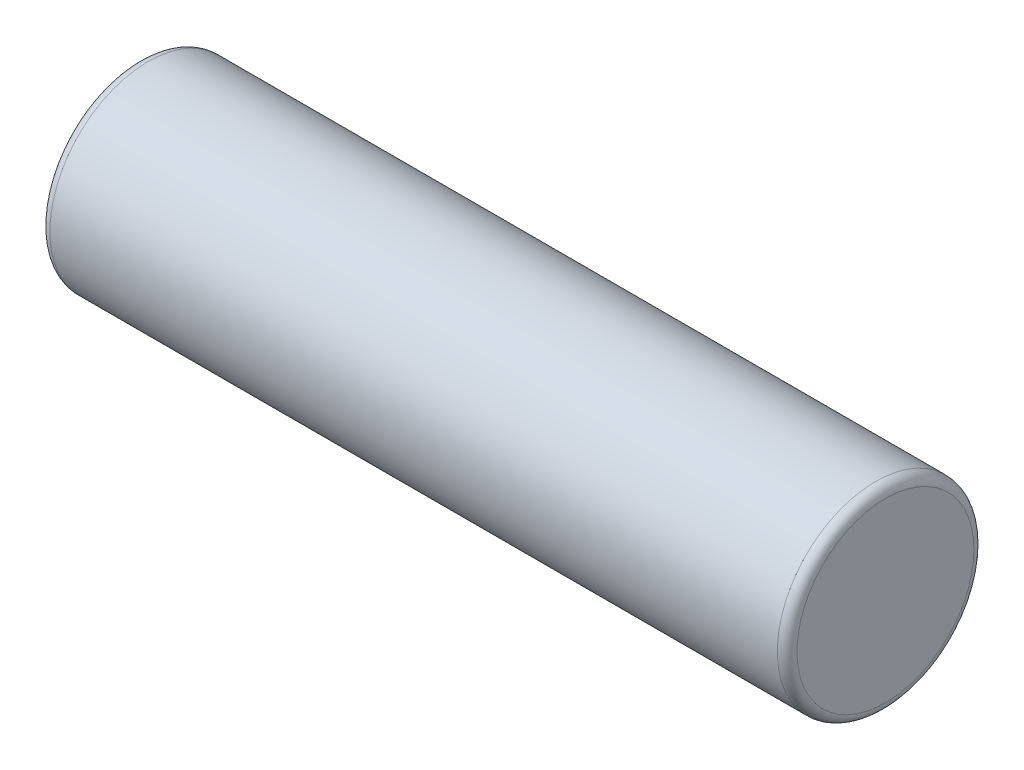
ISO-10303-21;
HEADER;
FILE_DESCRIPTION(('STEP AP214'),'2;1');
FILE_NAME('part.step','',(''),(''),'','','');
FILE_SCHEMA(('AUTOMOTIVE_DESIGN { 1 0 10303 214 1 1 1 1 }'));
ENDSEC;
DATA;
#1=APPLICATION_CONTEXT('core data for automotive mechanical design processes');
#2=APPLICATION_PROTOCOL_DEFINITION('international standard','automotive_design',2000,#1);
#3=PRODUCT_CONTEXT('',#1,'mechanical');
#4=PRODUCT('Part','Part','',(#3));
#5=PRODUCT_RELATED_PRODUCT_CATEGORY('part','',(#4));
#6=PRODUCT_DEFINITION_FORMATION('','',#4);
#7=PRODUCT_DEFINITION_CONTEXT('part definition',#1,'design');
#8=PRODUCT_DEFINITION('design','',#6,#7);
#9=PRODUCT_DEFINITION_SHAPE('','',#8);
#10=(LENGTH_UNIT() NAMED_UNIT(*) SI_UNIT(.MILLI.,.METRE.));
#11=(NAMED_UNIT(*) PLANE_ANGLE_UNIT() SI_UNIT($,.RADIAN.));
#12=(NAMED_UNIT(*) SI_UNIT($,.STERADIAN.) SOLID_ANGLE_UNIT());
#13=UNCERTAINTY_MEASURE_WITH_UNIT(LENGTH_MEASURE(1.E-05),#10,'distance_accuracy_value','');
#14=(GEOMETRIC_REPRESENTATION_CONTEXT(3) GLOBAL_UNCERTAINTY_ASSIGNED_CONTEXT((#13)) GLOBAL_UNIT_ASSIGNED_CONTEXT((#10,
#11,#12)) REPRESENTATION_CONTEXT('',''));
#15=CARTESIAN_POINT('',(0.,0.,0.));
#16=DIRECTION('',(0.,0.,1.));
#17=DIRECTION('',(1.,0.,0.));
#18=AXIS2_PLACEMENT_3D('',#15,#16,#17);
#19=CARTESIAN_POINT('',(-38.,0.,0.));
#20=DIRECTION('',(1.,0.,0.));
#21=DIRECTION('',(0.,0.,-1.));
#22=AXIS2_PLACEMENT_3D('',#19,#20,#21);
#23=CYLINDRICAL_SURFACE('',#22,10.);
#24=CARTESIAN_POINT('',(-37.,0.,0.));
#25=DIRECTION('',(1.,0.,0.));
#26=DIRECTION('',(0.,0.,-1.));
#27=AXIS2_PLACEMENT_3D('',#24,#25,#26);
#28=CIRCLE('',#27,10.);
#29=CARTESIAN_POINT('',(-37.,0.,-10.));
#30=VERTEX_POINT('',#29);
#31=EDGE_CURVE('E48',#30,#30,#28,.T.);
#32=ORIENTED_EDGE('',*,*,#31,.T.);
#33=EDGE_LOOP('',(#32));
#34=FACE_BOUND('',#33,.T.);
#35=CARTESIAN_POINT('',(37.,0.,0.));
#36=DIRECTION('',(1.,0.,0.));
#37=DIRECTION('',(0.,0.,-1.));
#38=AXIS2_PLACEMENT_3D('',#35,#36,#37);
#39=CIRCLE('',#38,10.);
#40=CARTESIAN_POINT('',(37.,0.,-10.));
#41=VERTEX_POINT('',#40);
#42=EDGE_CURVE('E52',#41,#41,#39,.F.);
#43=ORIENTED_EDGE('',*,*,#42,.T.);
#44=EDGE_LOOP('',(#43));
#45=FACE_BOUND('',#44,.T.);
#46=ADVANCED_FACE('F37',(#34,#45),#23,.T.);
#47=CARTESIAN_POINT('',(-38.,0.,0.));
#48=DIRECTION('',(1.,0.,0.));
#49=DIRECTION('',(0.,0.,-1.));
#50=AXIS2_PLACEMENT_3D('',#47,#48,#49);
#51=PLANE('',#50);
#52=CARTESIAN_POINT('',(-38.,0.,0.));
#53=DIRECTION('',(1.,0.,0.));
#54=DIRECTION('',(0.,0.,-1.));
#55=AXIS2_PLACEMENT_3D('',#52,#53,#54);
#56=CIRCLE('',#55,9.);
#57=CARTESIAN_POINT('',(-38.,0.,-9.));
#58=VERTEX_POINT('',#57);
#59=EDGE_CURVE('E44',#58,#58,#56,.F.);
#60=ORIENTED_EDGE('',*,*,#59,.T.);
#61=EDGE_LOOP('',(#60));
#62=FACE_BOUND('',#61,.T.);
#63=ADVANCED_FACE('F68',(#62),#51,.F.);
#64=CARTESIAN_POINT('',(38.,0.,0.));
#65=DIRECTION('',(1.,0.,0.));
#66=DIRECTION('',(0.,0.,-1.));
#67=AXIS2_PLACEMENT_3D('',#64,#65,#66);
#68=PLANE('',#67);
#69=CARTESIAN_POINT('',(38.,0.,0.));
#70=DIRECTION('',(1.,0.,0.));
#71=DIRECTION('',(0.,0.,-1.));
#72=AXIS2_PLACEMENT_3D('',#69,#70,#71);
#73=CIRCLE('',#72,9.);
#74=CARTESIAN_POINT('',(38.,0.,-9.));
#75=VERTEX_POINT('',#74);
#76=EDGE_CURVE('E10',#75,#75,#73,.T.);
#77=ORIENTED_EDGE('',*,*,#76,.T.);
#78=EDGE_LOOP('',(#77));
#79=FACE_BOUND('',#78,.T.);
#80=ADVANCED_FACE('F65',(#79),#68,.T.);
#81=CARTESIAN_POINT('',(-37.,0.,0.));
#82=DIRECTION('',(1.,0.,0.));
#83=DIRECTION('',(0.,0.,-1.));
#84=AXIS2_PLACEMENT_3D('',#81,#82,#83);
#85=TOROIDAL_SURFACE('',#84,9.,1.);
#86=ORIENTED_EDGE('',*,*,#59,.F.);
#87=EDGE_LOOP('',(#86));
#88=FACE_BOUND('',#87,.T.);
#89=ORIENTED_EDGE('',*,*,#31,.F.);
#90=EDGE_LOOP('',(#89));
#91=FACE_BOUND('',#90,.T.);
#92=ADVANCED_FACE('F61',(#88,#91),#85,.T.);
#93=CARTESIAN_POINT('',(37.,0.,0.));
#94=DIRECTION('',(1.,0.,0.));
#95=DIRECTION('',(0.,0.,-1.));
#96=AXIS2_PLACEMENT_3D('',#93,#94,#95);
#97=TOROIDAL_SURFACE('',#96,9.,1.);
#98=ORIENTED_EDGE('',*,*,#42,.F.);
#99=EDGE_LOOP('',(#98));
#100=FACE_BOUND('',#99,.T.);
#101=ORIENTED_EDGE('',*,*,#76,.F.);
#102=EDGE_LOOP('',(#101));
#103=FACE_BOUND('',#102,.T.);
#104=ADVANCED_FACE('F39',(#100,#103),#97,.T.);
#105=CLOSED_SHELL('',(#46,#63,#80,#92,#104));
#106=MANIFOLD_SOLID_BREP('B2',#105);
#107=ADVANCED_BREP_SHAPE_REPRESENTATION('',(#18,#106),#14);
#108=SHAPE_DEFINITION_REPRESENTATION(#9,#107);
ENDSEC;
END-ISO-10303-21;
